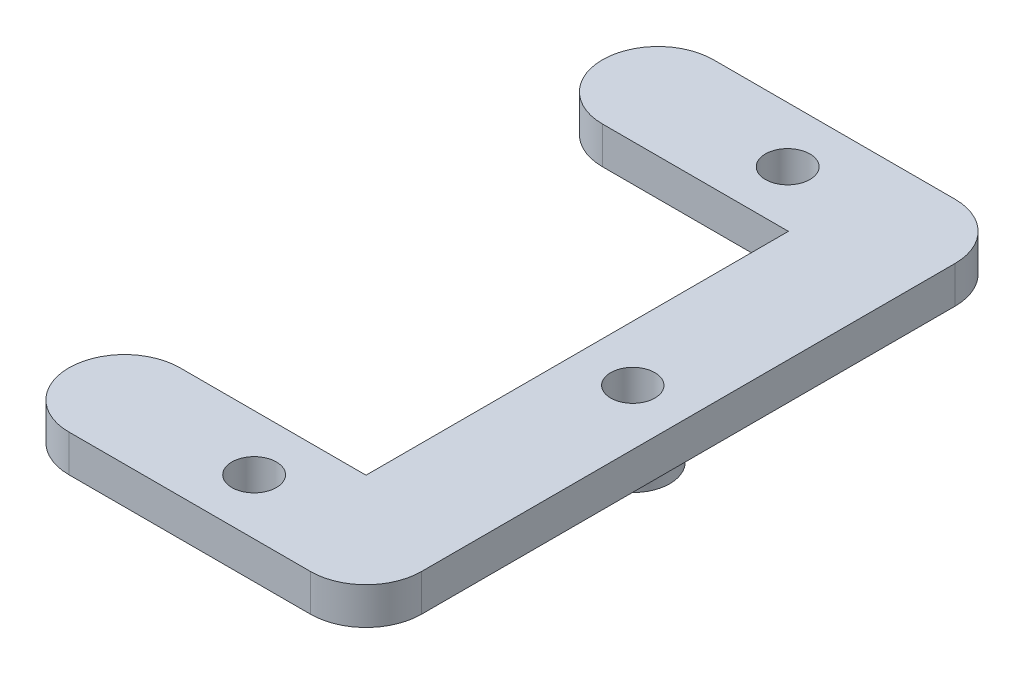
ISO-10303-21;
HEADER;
FILE_DESCRIPTION(('STEP AP214'),'2;1');
FILE_NAME('part.step','',(''),(''),'','','');
FILE_SCHEMA(('AUTOMOTIVE_DESIGN { 1 0 10303 214 1 1 1 1 }'));
ENDSEC;
DATA;
#1=APPLICATION_CONTEXT('core data for automotive mechanical design processes');
#2=APPLICATION_PROTOCOL_DEFINITION('international standard','automotive_design',2000,#1);
#3=PRODUCT_CONTEXT('',#1,'mechanical');
#4=PRODUCT('Part','Part','',(#3));
#5=PRODUCT_RELATED_PRODUCT_CATEGORY('part','',(#4));
#6=PRODUCT_DEFINITION_FORMATION('','',#4);
#7=PRODUCT_DEFINITION_CONTEXT('part definition',#1,'design');
#8=PRODUCT_DEFINITION('design','',#6,#7);
#9=PRODUCT_DEFINITION_SHAPE('','',#8);
#10=(LENGTH_UNIT() NAMED_UNIT(*) SI_UNIT(.MILLI.,.METRE.));
#11=(NAMED_UNIT(*) PLANE_ANGLE_UNIT() SI_UNIT($,.RADIAN.));
#12=(NAMED_UNIT(*) SI_UNIT($,.STERADIAN.) SOLID_ANGLE_UNIT());
#13=UNCERTAINTY_MEASURE_WITH_UNIT(LENGTH_MEASURE(1.E-05),#10,'distance_accuracy_value','');
#14=(GEOMETRIC_REPRESENTATION_CONTEXT(3) GLOBAL_UNCERTAINTY_ASSIGNED_CONTEXT((#13)) GLOBAL_UNIT_ASSIGNED_CONTEXT((#10,
#11,#12)) REPRESENTATION_CONTEXT('',''));
#15=CARTESIAN_POINT('',(0.,0.,0.));
#16=DIRECTION('',(0.,0.,1.));
#17=DIRECTION('',(1.,0.,0.));
#18=AXIS2_PLACEMENT_3D('',#15,#16,#17);
#19=CARTESIAN_POINT('',(-8.75,2.5,-18.));
#20=DIRECTION('',(0.,1.,0.));
#21=DIRECTION('',(0.,0.,1.));
#22=AXIS2_PLACEMENT_3D('',#19,#20,#21);
#23=PLANE('',#22);
#24=CARTESIAN_POINT('',(7.54999999999999,2.5,0.));
#25=DIRECTION('',(0.,1.,0.));
#26=DIRECTION('',(0.,0.,1.));
#27=AXIS2_PLACEMENT_3D('',#24,#25,#26);
#28=CIRCLE('',#27,1.49);
#29=CARTESIAN_POINT('',(7.54999999999999,2.5,1.49));
#30=VERTEX_POINT('',#29);
#31=EDGE_CURVE('E416',#30,#30,#28,.T.);
#32=ORIENTED_EDGE('',*,*,#31,.F.);
#33=EDGE_LOOP('',(#32));
#34=FACE_BOUND('',#33,.T.);
#35=CARTESIAN_POINT('',(0.,2.5,-18.));
#36=DIRECTION('',(0.,1.,0.));
#37=DIRECTION('',(0.,0.,1.));
#38=AXIS2_PLACEMENT_3D('',#35,#36,#37);
#39=CIRCLE('',#38,1.5);
#40=CARTESIAN_POINT('',(0.,2.5,-16.5));
#41=VERTEX_POINT('',#40);
#42=EDGE_CURVE('E163',#41,#41,#39,.T.);
#43=ORIENTED_EDGE('',*,*,#42,.F.);
#44=EDGE_LOOP('',(#43));
#45=FACE_BOUND('',#44,.T.);
#46=CARTESIAN_POINT('',(-8.75,2.5,-18.));
#47=DIRECTION('',(0.,1.,0.));
#48=DIRECTION('',(0.,0.,1.));
#49=AXIS2_PLACEMENT_3D('',#46,#47,#48);
#50=CIRCLE('',#49,3.75);
#51=CARTESIAN_POINT('',(-8.75,2.5,-21.75));
#52=VERTEX_POINT('',#51);
#53=CARTESIAN_POINT('',(-8.75,2.5,-14.25));
#54=VERTEX_POINT('',#53);
#55=EDGE_CURVE('E187',#52,#54,#50,.T.);
#56=ORIENTED_EDGE('',*,*,#55,.T.);
#57=DIRECTION('',(1.,0.,0.));
#58=VECTOR('',#57,1.);
#59=CARTESIAN_POINT('',(-8.75,2.5,-14.25));
#60=LINE('',#59,#58);
#61=CARTESIAN_POINT('',(3.79999999999999,2.5,-14.25));
#62=VERTEX_POINT('',#61);
#63=EDGE_CURVE('E111',#54,#62,#60,.T.);
#64=ORIENTED_EDGE('',*,*,#63,.T.);
#65=DIRECTION('',(0.,0.,1.));
#66=VECTOR('',#65,1.);
#67=CARTESIAN_POINT('',(3.79999999999999,2.5,-14.25));
#68=LINE('',#67,#66);
#69=CARTESIAN_POINT('',(3.8,2.5,14.25));
#70=VERTEX_POINT('',#69);
#71=EDGE_CURVE('E237',#62,#70,#68,.T.);
#72=ORIENTED_EDGE('',*,*,#71,.T.);
#73=DIRECTION('',(-1.,0.,0.));
#74=VECTOR('',#73,1.);
#75=CARTESIAN_POINT('',(3.8,2.5,14.25));
#76=LINE('',#75,#74);
#77=CARTESIAN_POINT('',(-8.75,2.5,14.25));
#78=VERTEX_POINT('',#77);
#79=EDGE_CURVE('E233',#70,#78,#76,.T.);
#80=ORIENTED_EDGE('',*,*,#79,.T.);
#81=CARTESIAN_POINT('',(-8.75,2.5,18.));
#82=DIRECTION('',(0.,1.,0.));
#83=DIRECTION('',(0.,0.,1.));
#84=AXIS2_PLACEMENT_3D('',#81,#82,#83);
#85=CIRCLE('',#84,3.75);
#86=CARTESIAN_POINT('',(-8.75,2.5,21.75));
#87=VERTEX_POINT('',#86);
#88=EDGE_CURVE('E236',#78,#87,#85,.T.);
#89=ORIENTED_EDGE('',*,*,#88,.T.);
#90=DIRECTION('',(1.,0.,0.));
#91=VECTOR('',#90,1.);
#92=CARTESIAN_POINT('',(-8.75,2.5,21.75));
#93=LINE('',#92,#91);
#94=CARTESIAN_POINT('',(7.54999999999999,2.5,21.75));
#95=VERTEX_POINT('',#94);
#96=EDGE_CURVE('E241',#87,#95,#93,.T.);
#97=ORIENTED_EDGE('',*,*,#96,.T.);
#98=CARTESIAN_POINT('',(7.54999999999999,2.5,18.));
#99=DIRECTION('',(0.,1.,0.));
#100=DIRECTION('',(0.,0.,-1.));
#101=AXIS2_PLACEMENT_3D('',#98,#99,#100);
#102=CIRCLE('',#101,3.75);
#103=CARTESIAN_POINT('',(11.3,2.5,18.));
#104=VERTEX_POINT('',#103);
#105=EDGE_CURVE('E136',#95,#104,#102,.T.);
#106=ORIENTED_EDGE('',*,*,#105,.T.);
#107=DIRECTION('',(0.,0.,-1.));
#108=VECTOR('',#107,1.);
#109=CARTESIAN_POINT('',(11.3,2.5,18.));
#110=LINE('',#109,#108);
#111=CARTESIAN_POINT('',(11.3,2.5,-18.));
#112=VERTEX_POINT('',#111);
#113=EDGE_CURVE('E130',#104,#112,#110,.T.);
#114=ORIENTED_EDGE('',*,*,#113,.T.);
#115=CARTESIAN_POINT('',(7.55,2.5,-18.));
#116=DIRECTION('',(0.,1.,0.));
#117=DIRECTION('',(0.,0.,1.));
#118=AXIS2_PLACEMENT_3D('',#115,#116,#117);
#119=CIRCLE('',#118,3.75);
#120=CARTESIAN_POINT('',(7.55,2.5,-21.75));
#121=VERTEX_POINT('',#120);
#122=EDGE_CURVE('E134',#112,#121,#119,.T.);
#123=ORIENTED_EDGE('',*,*,#122,.T.);
#124=DIRECTION('',(-1.,0.,0.));
#125=VECTOR('',#124,1.);
#126=CARTESIAN_POINT('',(7.54999999999999,2.5,-21.75));
#127=LINE('',#126,#125);
#128=EDGE_CURVE('E61',#121,#52,#127,.T.);
#129=ORIENTED_EDGE('',*,*,#128,.T.);
#130=EDGE_LOOP('',(#56,#64,#72,#80,#89,#97,#106,#114,#123,#129));
#131=FACE_BOUND('',#130,.T.);
#132=CARTESIAN_POINT('',(0.,2.5,18.));
#133=DIRECTION('',(0.,1.,0.));
#134=DIRECTION('',(0.,0.,1.));
#135=AXIS2_PLACEMENT_3D('',#132,#133,#134);
#136=CIRCLE('',#135,1.5);
#137=CARTESIAN_POINT('',(0.,2.5,19.5));
#138=VERTEX_POINT('',#137);
#139=EDGE_CURVE('E430',#138,#138,#136,.T.);
#140=ORIENTED_EDGE('',*,*,#139,.F.);
#141=EDGE_LOOP('',(#140));
#142=FACE_BOUND('',#141,.T.);
#143=ADVANCED_FACE('F43',(#34,#45,#131,#142),#23,.T.);
#144=CARTESIAN_POINT('',(-8.75,0.,-18.));
#145=DIRECTION('',(0.,1.,0.));
#146=DIRECTION('',(0.,0.,1.));
#147=AXIS2_PLACEMENT_3D('',#144,#145,#146);
#148=PLANE('',#147);
#149=CARTESIAN_POINT('',(7.54999999999999,0.,0.));
#150=DIRECTION('',(0.,1.,0.));
#151=DIRECTION('',(0.,0.,1.));
#152=AXIS2_PLACEMENT_3D('',#149,#150,#151);
#153=CIRCLE('',#152,2.5);
#154=CARTESIAN_POINT('',(7.54999999999999,0.,2.5));
#155=VERTEX_POINT('',#154);
#156=EDGE_CURVE('E11',#155,#155,#153,.F.);
#157=ORIENTED_EDGE('',*,*,#156,.F.);
#158=EDGE_LOOP('',(#157));
#159=FACE_BOUND('',#158,.T.);
#160=CARTESIAN_POINT('',(-8.75,0.,-18.));
#161=DIRECTION('',(0.,1.,0.));
#162=DIRECTION('',(0.,0.,1.));
#163=AXIS2_PLACEMENT_3D('',#160,#161,#162);
#164=CIRCLE('',#163,3.75);
#165=CARTESIAN_POINT('',(-8.75,0.,-21.75));
#166=VERTEX_POINT('',#165);
#167=CARTESIAN_POINT('',(-8.75,0.,-14.25));
#168=VERTEX_POINT('',#167);
#169=EDGE_CURVE('E158',#166,#168,#164,.T.);
#170=ORIENTED_EDGE('',*,*,#169,.F.);
#171=DIRECTION('',(-1.,0.,0.));
#172=VECTOR('',#171,1.);
#173=CARTESIAN_POINT('',(7.54999999999999,0.,-21.75));
#174=LINE('',#173,#172);
#175=CARTESIAN_POINT('',(7.55,0.,-21.75));
#176=VERTEX_POINT('',#175);
#177=EDGE_CURVE('E102',#176,#166,#174,.T.);
#178=ORIENTED_EDGE('',*,*,#177,.F.);
#179=CARTESIAN_POINT('',(7.55,0.,-18.));
#180=DIRECTION('',(0.,1.,0.));
#181=DIRECTION('',(0.,0.,1.));
#182=AXIS2_PLACEMENT_3D('',#179,#180,#181);
#183=CIRCLE('',#182,3.75);
#184=CARTESIAN_POINT('',(11.3,0.,-18.));
#185=VERTEX_POINT('',#184);
#186=EDGE_CURVE('E96',#185,#176,#183,.T.);
#187=ORIENTED_EDGE('',*,*,#186,.F.);
#188=DIRECTION('',(0.,0.,-1.));
#189=VECTOR('',#188,1.);
#190=CARTESIAN_POINT('',(11.3,0.,18.));
#191=LINE('',#190,#189);
#192=CARTESIAN_POINT('',(11.3,0.,18.));
#193=VERTEX_POINT('',#192);
#194=EDGE_CURVE('E145',#193,#185,#191,.T.);
#195=ORIENTED_EDGE('',*,*,#194,.F.);
#196=CARTESIAN_POINT('',(7.54999999999999,0.,18.));
#197=DIRECTION('',(0.,1.,0.));
#198=DIRECTION('',(0.,0.,-1.));
#199=AXIS2_PLACEMENT_3D('',#196,#197,#198);
#200=CIRCLE('',#199,3.75);
#201=CARTESIAN_POINT('',(7.54999999999999,0.,21.75));
#202=VERTEX_POINT('',#201);
#203=EDGE_CURVE('E178',#202,#193,#200,.T.);
#204=ORIENTED_EDGE('',*,*,#203,.F.);
#205=DIRECTION('',(1.,0.,0.));
#206=VECTOR('',#205,1.);
#207=CARTESIAN_POINT('',(-8.75,0.,21.75));
#208=LINE('',#207,#206);
#209=CARTESIAN_POINT('',(-8.75,0.,21.75));
#210=VERTEX_POINT('',#209);
#211=EDGE_CURVE('E175',#210,#202,#208,.T.);
#212=ORIENTED_EDGE('',*,*,#211,.F.);
#213=CARTESIAN_POINT('',(-8.75,0.,18.));
#214=DIRECTION('',(0.,1.,0.));
#215=DIRECTION('',(0.,0.,1.));
#216=AXIS2_PLACEMENT_3D('',#213,#214,#215);
#217=CIRCLE('',#216,3.75);
#218=CARTESIAN_POINT('',(-8.75,0.,14.25));
#219=VERTEX_POINT('',#218);
#220=EDGE_CURVE('E172',#219,#210,#217,.T.);
#221=ORIENTED_EDGE('',*,*,#220,.F.);
#222=DIRECTION('',(-1.,0.,0.));
#223=VECTOR('',#222,1.);
#224=CARTESIAN_POINT('',(3.8,0.,14.25));
#225=LINE('',#224,#223);
#226=CARTESIAN_POINT('',(3.8,0.,14.25));
#227=VERTEX_POINT('',#226);
#228=EDGE_CURVE('E169',#227,#219,#225,.T.);
#229=ORIENTED_EDGE('',*,*,#228,.F.);
#230=DIRECTION('',(0.,0.,1.));
#231=VECTOR('',#230,1.);
#232=CARTESIAN_POINT('',(3.79999999999999,0.,-14.25));
#233=LINE('',#232,#231);
#234=CARTESIAN_POINT('',(3.79999999999999,0.,-14.25));
#235=VERTEX_POINT('',#234);
#236=EDGE_CURVE('E166',#235,#227,#233,.T.);
#237=ORIENTED_EDGE('',*,*,#236,.F.);
#238=DIRECTION('',(1.,0.,0.));
#239=VECTOR('',#238,1.);
#240=CARTESIAN_POINT('',(-8.75,0.,-14.25));
#241=LINE('',#240,#239);
#242=EDGE_CURVE('E162',#168,#235,#241,.T.);
#243=ORIENTED_EDGE('',*,*,#242,.F.);
#244=EDGE_LOOP('',(#170,#178,#187,#195,#204,#212,#221,#229,#237,#243));
#245=FACE_BOUND('',#244,.T.);
#246=CARTESIAN_POINT('',(0.,0.,-18.));
#247=DIRECTION('',(0.,1.,0.));
#248=DIRECTION('',(0.,0.,1.));
#249=AXIS2_PLACEMENT_3D('',#246,#247,#248);
#250=CIRCLE('',#249,1.5);
#251=CARTESIAN_POINT('',(0.,0.,-16.5));
#252=VERTEX_POINT('',#251);
#253=EDGE_CURVE('E434',#252,#252,#250,.T.);
#254=ORIENTED_EDGE('',*,*,#253,.T.);
#255=EDGE_LOOP('',(#254));
#256=FACE_BOUND('',#255,.T.);
#257=CARTESIAN_POINT('',(0.,0.,18.));
#258=DIRECTION('',(0.,1.,0.));
#259=DIRECTION('',(0.,0.,1.));
#260=AXIS2_PLACEMENT_3D('',#257,#258,#259);
#261=CIRCLE('',#260,1.5);
#262=CARTESIAN_POINT('',(0.,0.,19.5));
#263=VERTEX_POINT('',#262);
#264=EDGE_CURVE('E429',#263,#263,#261,.T.);
#265=ORIENTED_EDGE('',*,*,#264,.T.);
#266=EDGE_LOOP('',(#265));
#267=FACE_BOUND('',#266,.T.);
#268=ADVANCED_FACE('F220',(#159,#245,#256,#267),#148,.F.);
#269=CARTESIAN_POINT('',(-8.75,2.5,-18.));
#270=DIRECTION('',(0.,-1.,0.));
#271=DIRECTION('',(0.,0.,-1.));
#272=AXIS2_PLACEMENT_3D('',#269,#270,#271);
#273=CYLINDRICAL_SURFACE('',#272,3.75);
#274=ORIENTED_EDGE('',*,*,#169,.T.);
#275=DIRECTION('',(0.,-1.,0.));
#276=VECTOR('',#275,1.);
#277=CARTESIAN_POINT('',(-8.75,2.5,-14.25));
#278=LINE('',#277,#276);
#279=EDGE_CURVE('E53',#54,#168,#278,.T.);
#280=ORIENTED_EDGE('',*,*,#279,.F.);
#281=ORIENTED_EDGE('',*,*,#55,.F.);
#282=DIRECTION('',(0.,-1.,0.));
#283=VECTOR('',#282,1.);
#284=CARTESIAN_POINT('',(-8.75,2.5,-21.75));
#285=LINE('',#284,#283);
#286=EDGE_CURVE('E154',#52,#166,#285,.T.);
#287=ORIENTED_EDGE('',*,*,#286,.T.);
#288=EDGE_LOOP('',(#274,#280,#281,#287));
#289=FACE_BOUND('',#288,.T.);
#290=ADVANCED_FACE('F45',(#289),#273,.T.);
#291=CARTESIAN_POINT('',(-8.75,2.5,-14.25));
#292=DIRECTION('',(0.,0.,-1.));
#293=DIRECTION('',(-1.,0.,0.));
#294=AXIS2_PLACEMENT_3D('',#291,#292,#293);
#295=PLANE('',#294);
#296=ORIENTED_EDGE('',*,*,#242,.T.);
#297=DIRECTION('',(0.,-1.,0.));
#298=VECTOR('',#297,1.);
#299=CARTESIAN_POINT('',(3.79999999999999,2.5,-14.25));
#300=LINE('',#299,#298);
#301=EDGE_CURVE('E210',#62,#235,#300,.T.);
#302=ORIENTED_EDGE('',*,*,#301,.F.);
#303=ORIENTED_EDGE('',*,*,#63,.F.);
#304=ORIENTED_EDGE('',*,*,#279,.T.);
#305=EDGE_LOOP('',(#296,#302,#303,#304));
#306=FACE_BOUND('',#305,.T.);
#307=ADVANCED_FACE('F215',(#306),#295,.F.);
#308=CARTESIAN_POINT('',(3.79999999999999,2.5,-14.25));
#309=DIRECTION('',(1.,0.,0.));
#310=DIRECTION('',(0.,0.,-1.));
#311=AXIS2_PLACEMENT_3D('',#308,#309,#310);
#312=PLANE('',#311);
#313=ORIENTED_EDGE('',*,*,#236,.T.);
#314=DIRECTION('',(0.,-1.,0.));
#315=VECTOR('',#314,1.);
#316=CARTESIAN_POINT('',(3.8,2.5,14.25));
#317=LINE('',#316,#315);
#318=EDGE_CURVE('E206',#70,#227,#317,.T.);
#319=ORIENTED_EDGE('',*,*,#318,.F.);
#320=ORIENTED_EDGE('',*,*,#71,.F.);
#321=ORIENTED_EDGE('',*,*,#301,.T.);
#322=EDGE_LOOP('',(#313,#319,#320,#321));
#323=FACE_BOUND('',#322,.T.);
#324=ADVANCED_FACE('F227',(#323),#312,.F.);
#325=CARTESIAN_POINT('',(3.8,2.5,14.25));
#326=DIRECTION('',(0.,0.,1.));
#327=DIRECTION('',(1.,0.,0.));
#328=AXIS2_PLACEMENT_3D('',#325,#326,#327);
#329=PLANE('',#328);
#330=ORIENTED_EDGE('',*,*,#228,.T.);
#331=DIRECTION('',(0.,-1.,0.));
#332=VECTOR('',#331,1.);
#333=CARTESIAN_POINT('',(-8.75,2.5,14.25));
#334=LINE('',#333,#332);
#335=EDGE_CURVE('E202',#78,#219,#334,.T.);
#336=ORIENTED_EDGE('',*,*,#335,.F.);
#337=ORIENTED_EDGE('',*,*,#79,.F.);
#338=ORIENTED_EDGE('',*,*,#318,.T.);
#339=EDGE_LOOP('',(#330,#336,#337,#338));
#340=FACE_BOUND('',#339,.T.);
#341=ADVANCED_FACE('F231',(#340),#329,.F.);
#342=CARTESIAN_POINT('',(-8.75,2.5,18.));
#343=DIRECTION('',(0.,-1.,0.));
#344=DIRECTION('',(0.,0.,-1.));
#345=AXIS2_PLACEMENT_3D('',#342,#343,#344);
#346=CYLINDRICAL_SURFACE('',#345,3.75);
#347=ORIENTED_EDGE('',*,*,#220,.T.);
#348=DIRECTION('',(0.,-1.,0.));
#349=VECTOR('',#348,1.);
#350=CARTESIAN_POINT('',(-8.75,2.5,21.75));
#351=LINE('',#350,#349);
#352=EDGE_CURVE('E198',#87,#210,#351,.T.);
#353=ORIENTED_EDGE('',*,*,#352,.F.);
#354=ORIENTED_EDGE('',*,*,#88,.F.);
#355=ORIENTED_EDGE('',*,*,#335,.T.);
#356=EDGE_LOOP('',(#347,#353,#354,#355));
#357=FACE_BOUND('',#356,.T.);
#358=ADVANCED_FACE('F258',(#357),#346,.T.);
#359=CARTESIAN_POINT('',(-8.75,2.5,21.75));
#360=DIRECTION('',(0.,0.,-1.));
#361=DIRECTION('',(-1.,0.,0.));
#362=AXIS2_PLACEMENT_3D('',#359,#360,#361);
#363=PLANE('',#362);
#364=ORIENTED_EDGE('',*,*,#211,.T.);
#365=DIRECTION('',(0.,-1.,0.));
#366=VECTOR('',#365,1.);
#367=CARTESIAN_POINT('',(7.54999999999999,2.5,21.75));
#368=LINE('',#367,#366);
#369=EDGE_CURVE('E194',#95,#202,#368,.T.);
#370=ORIENTED_EDGE('',*,*,#369,.F.);
#371=ORIENTED_EDGE('',*,*,#96,.F.);
#372=ORIENTED_EDGE('',*,*,#352,.T.);
#373=EDGE_LOOP('',(#364,#370,#371,#372));
#374=FACE_BOUND('',#373,.T.);
#375=ADVANCED_FACE('F252',(#374),#363,.F.);
#376=CARTESIAN_POINT('',(7.54999999999999,2.5,18.));
#377=DIRECTION('',(0.,-1.,0.));
#378=DIRECTION('',(0.,0.,-1.));
#379=AXIS2_PLACEMENT_3D('',#376,#377,#378);
#380=CYLINDRICAL_SURFACE('',#379,3.75);
#381=ORIENTED_EDGE('',*,*,#203,.T.);
#382=DIRECTION('',(0.,-1.,0.));
#383=VECTOR('',#382,1.);
#384=CARTESIAN_POINT('',(11.3,2.5,18.));
#385=LINE('',#384,#383);
#386=EDGE_CURVE('E147',#104,#193,#385,.T.);
#387=ORIENTED_EDGE('',*,*,#386,.F.);
#388=ORIENTED_EDGE('',*,*,#105,.F.);
#389=ORIENTED_EDGE('',*,*,#369,.T.);
#390=EDGE_LOOP('',(#381,#387,#388,#389));
#391=FACE_BOUND('',#390,.T.);
#392=ADVANCED_FACE('F256',(#391),#380,.T.);
#393=CARTESIAN_POINT('',(11.3,2.5,18.));
#394=DIRECTION('',(-1.,0.,0.));
#395=DIRECTION('',(0.,0.,1.));
#396=AXIS2_PLACEMENT_3D('',#393,#394,#395);
#397=PLANE('',#396);
#398=ORIENTED_EDGE('',*,*,#194,.T.);
#399=DIRECTION('',(0.,-1.,0.));
#400=VECTOR('',#399,1.);
#401=CARTESIAN_POINT('',(11.3,2.5,-18.));
#402=LINE('',#401,#400);
#403=EDGE_CURVE('E142',#112,#185,#402,.T.);
#404=ORIENTED_EDGE('',*,*,#403,.F.);
#405=ORIENTED_EDGE('',*,*,#113,.F.);
#406=ORIENTED_EDGE('',*,*,#386,.T.);
#407=EDGE_LOOP('',(#398,#404,#405,#406));
#408=FACE_BOUND('',#407,.T.);
#409=ADVANCED_FACE('F143',(#408),#397,.F.);
#410=CARTESIAN_POINT('',(7.55,2.5,-18.));
#411=DIRECTION('',(0.,-1.,0.));
#412=DIRECTION('',(0.,0.,-1.));
#413=AXIS2_PLACEMENT_3D('',#410,#411,#412);
#414=CYLINDRICAL_SURFACE('',#413,3.75);
#415=ORIENTED_EDGE('',*,*,#186,.T.);
#416=DIRECTION('',(0.,-1.,0.));
#417=VECTOR('',#416,1.);
#418=CARTESIAN_POINT('',(7.55,2.5,-21.75));
#419=LINE('',#418,#417);
#420=EDGE_CURVE('E148',#121,#176,#419,.T.);
#421=ORIENTED_EDGE('',*,*,#420,.F.);
#422=ORIENTED_EDGE('',*,*,#122,.F.);
#423=ORIENTED_EDGE('',*,*,#403,.T.);
#424=EDGE_LOOP('',(#415,#421,#422,#423));
#425=FACE_BOUND('',#424,.T.);
#426=ADVANCED_FACE('F150',(#425),#414,.T.);
#427=CARTESIAN_POINT('',(7.54999999999999,2.5,-21.75));
#428=DIRECTION('',(0.,0.,1.));
#429=DIRECTION('',(1.,0.,0.));
#430=AXIS2_PLACEMENT_3D('',#427,#428,#429);
#431=PLANE('',#430);
#432=ORIENTED_EDGE('',*,*,#177,.T.);
#433=ORIENTED_EDGE('',*,*,#286,.F.);
#434=ORIENTED_EDGE('',*,*,#128,.F.);
#435=ORIENTED_EDGE('',*,*,#420,.T.);
#436=EDGE_LOOP('',(#432,#433,#434,#435));
#437=FACE_BOUND('',#436,.T.);
#438=ADVANCED_FACE('F281',(#437),#431,.F.);
#439=CARTESIAN_POINT('',(0.,2.5,-18.));
#440=DIRECTION('',(0.,-1.,0.));
#441=DIRECTION('',(0.,0.,-1.));
#442=AXIS2_PLACEMENT_3D('',#439,#440,#441);
#443=CYLINDRICAL_SURFACE('',#442,1.5);
#444=ORIENTED_EDGE('',*,*,#42,.T.);
#445=EDGE_LOOP('',(#444));
#446=FACE_BOUND('',#445,.T.);
#447=ORIENTED_EDGE('',*,*,#253,.F.);
#448=EDGE_LOOP('',(#447));
#449=FACE_BOUND('',#448,.T.);
#450=ADVANCED_FACE('F278',(#446,#449),#443,.F.);
#451=CARTESIAN_POINT('',(0.,2.5,18.));
#452=DIRECTION('',(0.,-1.,0.));
#453=DIRECTION('',(0.,0.,-1.));
#454=AXIS2_PLACEMENT_3D('',#451,#452,#453);
#455=CYLINDRICAL_SURFACE('',#454,1.5);
#456=ORIENTED_EDGE('',*,*,#139,.T.);
#457=EDGE_LOOP('',(#456));
#458=FACE_BOUND('',#457,.T.);
#459=ORIENTED_EDGE('',*,*,#264,.F.);
#460=EDGE_LOOP('',(#459));
#461=FACE_BOUND('',#460,.T.);
#462=ADVANCED_FACE('F311',(#458,#461),#455,.F.);
#463=CARTESIAN_POINT('',(7.54999999999999,-2.,0.));
#464=DIRECTION('',(0.,1.,0.));
#465=DIRECTION('',(0.,0.,1.));
#466=AXIS2_PLACEMENT_3D('',#463,#464,#465);
#467=CYLINDRICAL_SURFACE('',#466,2.5);
#468=CARTESIAN_POINT('',(7.54999999999999,-2.,0.));
#469=DIRECTION('',(0.,-1.,0.));
#470=DIRECTION('',(0.,0.,-1.));
#471=AXIS2_PLACEMENT_3D('',#468,#469,#470);
#472=CIRCLE('',#471,2.5);
#473=CARTESIAN_POINT('',(7.54999999999999,-2.,-2.5));
#474=VERTEX_POINT('',#473);
#475=EDGE_CURVE('E423',#474,#474,#472,.T.);
#476=ORIENTED_EDGE('',*,*,#475,.F.);
#477=EDGE_LOOP('',(#476));
#478=FACE_BOUND('',#477,.T.);
#479=ORIENTED_EDGE('',*,*,#156,.T.);
#480=EDGE_LOOP('',(#479));
#481=FACE_BOUND('',#480,.T.);
#482=ADVANCED_FACE('F318',(#478,#481),#467,.T.);
#483=CARTESIAN_POINT('',(7.54999999999999,-2.,0.));
#484=DIRECTION('',(0.,-1.,0.));
#485=DIRECTION('',(0.,0.,-1.));
#486=AXIS2_PLACEMENT_3D('',#483,#484,#485);
#487=PLANE('',#486);
#488=CARTESIAN_POINT('',(7.54999999999999,-2.,0.));
#489=DIRECTION('',(0.,-1.,0.));
#490=DIRECTION('',(0.,0.,-1.));
#491=AXIS2_PLACEMENT_3D('',#488,#489,#490);
#492=CIRCLE('',#491,1.49);
#493=CARTESIAN_POINT('',(7.54999999999999,-2.,-1.49));
#494=VERTEX_POINT('',#493);
#495=EDGE_CURVE('E419',#494,#494,#492,.T.);
#496=ORIENTED_EDGE('',*,*,#495,.F.);
#497=EDGE_LOOP('',(#496));
#498=FACE_BOUND('',#497,.T.);
#499=ORIENTED_EDGE('',*,*,#475,.T.);
#500=EDGE_LOOP('',(#499));
#501=FACE_BOUND('',#500,.T.);
#502=ADVANCED_FACE('F326',(#498,#501),#487,.T.);
#503=CARTESIAN_POINT('',(7.54999999999999,5.,0.));
#504=DIRECTION('',(0.,-1.,0.));
#505=DIRECTION('',(0.,0.,-1.));
#506=AXIS2_PLACEMENT_3D('',#503,#504,#505);
#507=CYLINDRICAL_SURFACE('',#506,1.49);
#508=ORIENTED_EDGE('',*,*,#31,.T.);
#509=EDGE_LOOP('',(#508));
#510=FACE_BOUND('',#509,.T.);
#511=ORIENTED_EDGE('',*,*,#495,.T.);
#512=EDGE_LOOP('',(#511));
#513=FACE_BOUND('',#512,.T.);
#514=ADVANCED_FACE('F334',(#510,#513),#507,.F.);
#515=CLOSED_SHELL('',(#143,#268,#290,#307,#324,#341,#358,#375,#392,#409,#426,#438,#450,#462,
#482,#502,#514));
#516=MANIFOLD_SOLID_BREP('B2',#515);
#517=ADVANCED_BREP_SHAPE_REPRESENTATION('',(#18,#516),#14);
#518=SHAPE_DEFINITION_REPRESENTATION(#9,#517);
ENDSEC;
END-ISO-10303-21;
